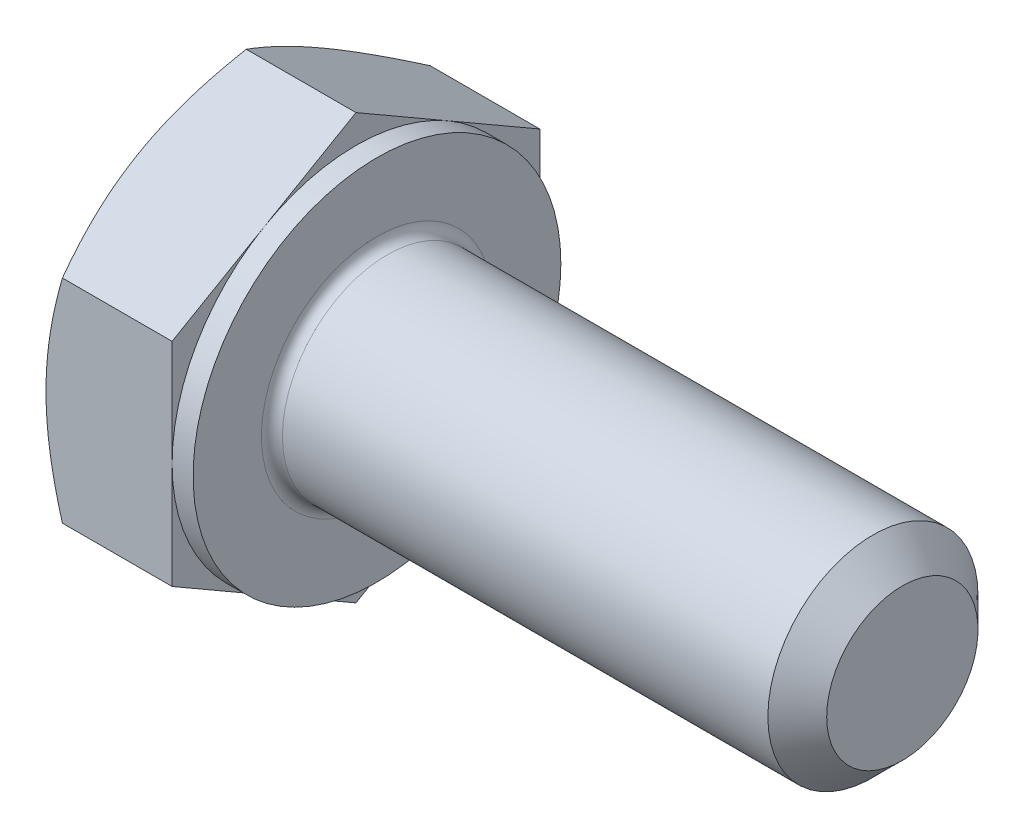
ISO-10303-21;
HEADER;
FILE_DESCRIPTION(('STEP AP214'),'2;1');
FILE_NAME('part.step','',(''),(''),'','','');
FILE_SCHEMA(('AUTOMOTIVE_DESIGN { 1 0 10303 214 1 1 1 1 }'));
ENDSEC;
DATA;
#1=APPLICATION_CONTEXT('core data for automotive mechanical design processes');
#2=APPLICATION_PROTOCOL_DEFINITION('international standard','automotive_design',2000,#1);
#3=PRODUCT_CONTEXT('',#1,'mechanical');
#4=PRODUCT('Part','Part','',(#3));
#5=PRODUCT_RELATED_PRODUCT_CATEGORY('part','',(#4));
#6=PRODUCT_DEFINITION_FORMATION('','',#4);
#7=PRODUCT_DEFINITION_CONTEXT('part definition',#1,'design');
#8=PRODUCT_DEFINITION('design','',#6,#7);
#9=PRODUCT_DEFINITION_SHAPE('','',#8);
#10=(LENGTH_UNIT() NAMED_UNIT(*) SI_UNIT(.MILLI.,.METRE.));
#11=(NAMED_UNIT(*) PLANE_ANGLE_UNIT() SI_UNIT($,.RADIAN.));
#12=(NAMED_UNIT(*) SI_UNIT($,.STERADIAN.) SOLID_ANGLE_UNIT());
#13=UNCERTAINTY_MEASURE_WITH_UNIT(LENGTH_MEASURE(1.E-05),#10,'distance_accuracy_value','');
#14=(GEOMETRIC_REPRESENTATION_CONTEXT(3) GLOBAL_UNCERTAINTY_ASSIGNED_CONTEXT((#13)) GLOBAL_UNIT_ASSIGNED_CONTEXT((#10,
#11,#12)) REPRESENTATION_CONTEXT('',''));
#15=CARTESIAN_POINT('',(0.,0.,0.));
#16=DIRECTION('',(0.,0.,1.));
#17=DIRECTION('',(1.,0.,0.));
#18=AXIS2_PLACEMENT_3D('',#15,#16,#17);
#19=CARTESIAN_POINT('',(2.8,2.02072594216368,-3.5));
#20=DIRECTION('',(0.,-0.866025403784438,0.500000000000002));
#21=DIRECTION('',(0.,-0.500000000000002,-0.866025403784438));
#22=AXIS2_PLACEMENT_3D('',#19,#20,#21);
#23=PLANE('',#22);
#24=DIRECTION('',(0.,0.500000000000002,0.866025403784438));
#25=VECTOR('',#24,1.);
#26=CARTESIAN_POINT('',(2.4,2.02072594216368,-3.5));
#27=LINE('',#26,#25);
#28=CARTESIAN_POINT('',(2.4,2.02072594216368,-3.5));
#29=VERTEX_POINT('',#28);
#30=CARTESIAN_POINT('',(2.4,3.03108891324553,-1.75000000000001));
#31=VERTEX_POINT('',#30);
#32=EDGE_CURVE('E176',#29,#31,#27,.T.);
#33=ORIENTED_EDGE('',*,*,#32,.F.);
#34=DIRECTION('',(-1.,0.,0.));
#35=VECTOR('',#34,1.);
#36=CARTESIAN_POINT('',(2.8,2.02072594216368,-3.5));
#37=LINE('',#36,#35);
#38=CARTESIAN_POINT('',(0.312607391169639,2.02072594216368,-3.5));
#39=VERTEX_POINT('',#38);
#40=EDGE_CURVE('E304',#29,#39,#37,.T.);
#41=ORIENTED_EDGE('',*,*,#40,.T.);
#42=CARTESIAN_POINT('',(0.312674060693371,4.04156735438122,0.00020000000000009));
#43=CARTESIAN_POINT('',(0.261385788989984,3.9527667384984,-0.153607178452449));
#44=CARTESIAN_POINT('',(0.214740953816198,3.86319960126198,-0.308742010834423));
#45=CARTESIAN_POINT('',(0.133321875533349,3.68251437287562,-0.621698006576781));
#46=CARTESIAN_POINT('',(0.0985764355845617,3.59139307116725,-0.779524730787495));
#47=CARTESIAN_POINT('',(0.0444900271828361,3.41027974688034,-1.09322221038013));
#48=CARTESIAN_POINT('',(0.0247890862603813,3.32031559103708,-1.24904469916069));
#49=CARTESIAN_POINT('',(0.00127013273725378,3.13996396008051,-1.56142288720537));
#50=CARTESIAN_POINT('',(-0.00256735545443556,3.04957714051106,-1.71797745103423));
#51=CARTESIAN_POINT('',(0.00541530187697638,2.88068384499777,-2.01050921992099));
#52=CARTESIAN_POINT('',(0.0152754340696055,2.80215208834114,-2.1465302124579));
#53=CARTESIAN_POINT('',(0.0465264668994014,2.64560020969753,-2.41768602028899));
#54=CARTESIAN_POINT('',(0.0679280432857958,2.56758062920649,-2.55281989768468));
#55=CARTESIAN_POINT('',(0.121430407880574,2.41070596159678,-2.82453479240518));
#56=CARTESIAN_POINT('',(0.153757994445084,2.33187072981463,-2.96108141927833));
#57=CARTESIAN_POINT('',(0.22712893380799,2.17537608630782,-3.2321380929445));
#58=CARTESIAN_POINT('',(0.268155046569863,2.09771466960098,-3.36665161246853));
#59=CARTESIAN_POINT('',(0.312674060693367,2.02061047210985,-3.5002));
#60=B_SPLINE_CURVE_WITH_KNOTS('',3,(#42,#43,#44,#45,#46,#47,#48,#49,#50,#51,#52,#53,#54,#55,#56,
#57,#58,#59),.UNSPECIFIED.,.F.,.F.,(4,2,2,2,2,2,2,2,4),(0.,0.554793832886253,1.11092123814984,
1.65328467083219,2.19498204478403,2.6666513085086,3.13875761298267,3.6213361260051,
4.10296698719187),.UNSPECIFIED.);
#61=CARTESIAN_POINT('',(0.,3.03108891324553,-1.75000000000001));
#62=VERTEX_POINT('',#61);
#63=EDGE_CURVE('E231',#62,#39,#60,.T.);
#64=ORIENTED_EDGE('',*,*,#63,.F.);
#65=CARTESIAN_POINT('',(0.312607391169643,4.04145188432738,0.));
#66=VERTEX_POINT('',#65);
#67=EDGE_CURVE('E67',#66,#62,#60,.T.);
#68=ORIENTED_EDGE('',*,*,#67,.F.);
#69=DIRECTION('',(-1.,0.,0.));
#70=VECTOR('',#69,1.);
#71=CARTESIAN_POINT('',(2.8,4.04145188432738,0.));
#72=LINE('',#71,#70);
#73=CARTESIAN_POINT('',(2.4,4.04145188432738,0.));
#74=VERTEX_POINT('',#73);
#75=EDGE_CURVE('E296',#74,#66,#72,.T.);
#76=ORIENTED_EDGE('',*,*,#75,.F.);
#77=EDGE_CURVE('E174',#31,#74,#27,.T.);
#78=ORIENTED_EDGE('',*,*,#77,.F.);
#79=EDGE_LOOP('',(#33,#41,#64,#68,#76,#78));
#80=FACE_BOUND('',#79,.T.);
#81=ADVANCED_FACE('F44',(#80),#23,.F.);
#82=CARTESIAN_POINT('',(2.8,4.04145188432738,0.));
#83=DIRECTION('',(0.,-0.866025403784438,-0.500000000000001));
#84=DIRECTION('',(0.,0.500000000000001,-0.866025403784438));
#85=AXIS2_PLACEMENT_3D('',#82,#83,#84);
#86=PLANE('',#85);
#87=DIRECTION('',(0.,-0.500000000000001,0.866025403784438));
#88=VECTOR('',#87,1.);
#89=CARTESIAN_POINT('',(2.4,4.04145188432738,0.));
#90=LINE('',#89,#88);
#91=CARTESIAN_POINT('',(2.4,3.03108891324553,1.75));
#92=VERTEX_POINT('',#91);
#93=EDGE_CURVE('E173',#74,#92,#90,.T.);
#94=ORIENTED_EDGE('',*,*,#93,.F.);
#95=ORIENTED_EDGE('',*,*,#75,.T.);
#96=CARTESIAN_POINT('',(0.31267406069337,2.02061047210985,3.5002));
#97=CARTESIAN_POINT('',(0.261385788989983,2.10941108799267,3.34639282154755));
#98=CARTESIAN_POINT('',(0.214740953816196,2.19897822522909,3.19125798916558));
#99=CARTESIAN_POINT('',(0.133321875533349,2.37966345361545,2.87830199342322));
#100=CARTESIAN_POINT('',(0.0985764355845616,2.47078475532382,2.72047526921251));
#101=CARTESIAN_POINT('',(0.0444900271828365,2.65189807961073,2.40677778961988));
#102=CARTESIAN_POINT('',(0.0247890862603821,2.74186223545399,2.25095530083931));
#103=CARTESIAN_POINT('',(0.00127013273725481,2.92221386641055,1.93857711279463));
#104=CARTESIAN_POINT('',(-0.00256735545443446,3.01260068598001,1.78202254896577));
#105=CARTESIAN_POINT('',(0.00541530187697789,3.1814939814933,1.48949078007901));
#106=CARTESIAN_POINT('',(0.0152754340696074,3.26002573814993,1.3534697875421));
#107=CARTESIAN_POINT('',(0.0465264668994039,3.41657761679354,1.08231397971101));
#108=CARTESIAN_POINT('',(0.0679280432857986,3.49459719728458,0.94718010231532));
#109=CARTESIAN_POINT('',(0.121430407880577,3.65147186489429,0.675465207594818));
#110=CARTESIAN_POINT('',(0.153757994445087,3.73030709667644,0.538918580721666));
#111=CARTESIAN_POINT('',(0.227128933807995,3.88680174018324,0.267861907055499));
#112=CARTESIAN_POINT('',(0.268155046569867,3.96446315689009,0.133348387531464));
#113=CARTESIAN_POINT('',(0.312674060693371,4.04156735438122,-0.000200000000000033));
#114=B_SPLINE_CURVE_WITH_KNOTS('',3,(#96,#97,#98,#99,#100,#101,#102,#103,#104,#105,#106,#107,
#108,#109,#110,#111,#112,#113),.UNSPECIFIED.,.F.,.F.,(4,2,2,2,2,2,2,2,4),(0.,0.554793832886253,
1.11092123814984,1.65328467083219,2.19498204478403,2.6666513085086,3.13875761298267,
3.6213361260051,4.10296698719188),.UNSPECIFIED.);
#115=CARTESIAN_POINT('',(0.,3.03108891324553,1.75));
#116=VERTEX_POINT('',#115);
#117=EDGE_CURVE('E228',#116,#66,#114,.T.);
#118=ORIENTED_EDGE('',*,*,#117,.F.);
#119=CARTESIAN_POINT('',(0.312607391169642,2.02072594216369,3.5));
#120=VERTEX_POINT('',#119);
#121=EDGE_CURVE('E242',#120,#116,#114,.T.);
#122=ORIENTED_EDGE('',*,*,#121,.F.);
#123=DIRECTION('',(-1.,0.,0.));
#124=VECTOR('',#123,1.);
#125=CARTESIAN_POINT('',(2.8,2.02072594216369,3.5));
#126=LINE('',#125,#124);
#127=CARTESIAN_POINT('',(2.4,2.02072594216369,3.5));
#128=VERTEX_POINT('',#127);
#129=EDGE_CURVE('E298',#128,#120,#126,.T.);
#130=ORIENTED_EDGE('',*,*,#129,.F.);
#131=EDGE_CURVE('E141',#92,#128,#90,.T.);
#132=ORIENTED_EDGE('',*,*,#131,.F.);
#133=EDGE_LOOP('',(#94,#95,#118,#122,#130,#132));
#134=FACE_BOUND('',#133,.T.);
#135=ADVANCED_FACE('F249',(#134),#86,.F.);
#136=CARTESIAN_POINT('',(2.8,2.02072594216369,3.5));
#137=DIRECTION('',(0.,0.,-1.));
#138=DIRECTION('',(0.,1.,0.));
#139=AXIS2_PLACEMENT_3D('',#136,#137,#138);
#140=PLANE('',#139);
#141=DIRECTION('',(0.,-1.,0.));
#142=VECTOR('',#141,1.);
#143=CARTESIAN_POINT('',(2.4,2.02072594216369,3.5));
#144=LINE('',#143,#142);
#145=CARTESIAN_POINT('',(2.4,0.,3.5));
#146=VERTEX_POINT('',#145);
#147=EDGE_CURVE('E135',#128,#146,#144,.T.);
#148=ORIENTED_EDGE('',*,*,#147,.F.);
#149=ORIENTED_EDGE('',*,*,#129,.T.);
#150=CARTESIAN_POINT('',(1.74876972157985,-5.5115599132137,3.5));
#151=CARTESIAN_POINT('',(1.67392335905172,-5.35795146168121,3.5));
#152=CARTESIAN_POINT('',(1.59977092482586,-5.20399921009229,3.5));
#153=CARTESIAN_POINT('',(1.45324265085097,-4.89522454872942,3.5));
#154=CARTESIAN_POINT('',(1.38086707569564,-4.74040201352889,3.5));
#155=CARTESIAN_POINT('',(1.23793493282187,-4.42894615034129,3.5));
#156=CARTESIAN_POINT('',(1.16738971082228,-4.27230759822603,3.5));
#157=CARTESIAN_POINT('',(1.02907715104182,-3.95781335182267,3.5));
#158=CARTESIAN_POINT('',(0.961309687300881,-3.79995771311103,3.5));
#159=CARTESIAN_POINT('',(0.827049257300872,-3.47741113153966,3.5));
#160=CARTESIAN_POINT('',(0.760677039603644,-3.31266966015408,3.5));
#161=CARTESIAN_POINT('',(0.632756390660457,-2.98129055183975,3.5));
#162=CARTESIAN_POINT('',(0.571208488744788,-2.81465270912936,3.5));
#163=CARTESIAN_POINT('',(0.45449093522313,-2.4795013503069,3.5));
#164=CARTESIAN_POINT('',(0.399309072211485,-2.31099212862997,3.5));
#165=CARTESIAN_POINT('',(0.297038623006441,-1.9715578800388,3.5));
#166=CARTESIAN_POINT('',(0.24994757531026,-1.80063360505408,3.5));
#167=CARTESIAN_POINT('',(0.166312731854845,-1.45721769418155,3.5));
#168=CARTESIAN_POINT('',(0.129709932807457,-1.284740691287,3.5));
#169=CARTESIAN_POINT('',(0.0690664438522187,-0.937557025087322,3.5));
#170=CARTESIAN_POINT('',(0.0450243878605948,-0.762850606367506,3.5));
#171=CARTESIAN_POINT('',(0.0117307991317262,-0.414396256841887,3.5));
#172=CARTESIAN_POINT('',(0.00228260582207095,-0.240667592567818,3.5));
#173=CARTESIAN_POINT('',(-0.00154556659444812,0.106974360360028,3.5));
#174=CARTESIAN_POINT('',(0.0040746764578058,0.280887651698036,3.5));
#175=CARTESIAN_POINT('',(0.0258160054827262,0.573677729994452,3.5));
#176=CARTESIAN_POINT('',(0.0381294862842104,0.692856453275192,3.5));
#177=CARTESIAN_POINT('',(0.0691104272904708,0.930390570440083,3.5));
#178=CARTESIAN_POINT('',(0.087778680144814,1.04874585973468,3.5));
#179=CARTESIAN_POINT('',(0.152339395306958,1.40238821087656,3.5));
#180=CARTESIAN_POINT('',(0.206777964143629,1.636135180366,3.5));
#181=CARTESIAN_POINT('',(0.301818253018758,1.98584040729011,3.5));
#182=CARTESIAN_POINT('',(0.336200477312341,2.10359260573206,3.5));
#183=CARTESIAN_POINT('',(0.408694225276307,2.33795452904031,3.5));
#184=CARTESIAN_POINT('',(0.446805777714548,2.45456424508593,3.5));
#185=CARTESIAN_POINT('',(0.526133500138817,2.68667648503229,3.5));
#186=CARTESIAN_POINT('',(0.56734879681971,2.80217931014602,3.5));
#187=CARTESIAN_POINT('',(0.652383318084217,3.03221622177691,3.5));
#188=CARTESIAN_POINT('',(0.696202482848095,3.1467503304798,3.5));
#189=CARTESIAN_POINT('',(0.81758641923347,3.45518824474217,3.5));
#190=CARTESIAN_POINT('',(0.897216282952764,3.64827858337667,3.5));
#191=CARTESIAN_POINT('',(1.061161216531,4.03246733734998,3.5));
#192=CARTESIAN_POINT('',(1.1454768083918,4.22356552793097,3.5));
#193=CARTESIAN_POINT('',(1.31768022375102,4.60422080078617,3.5));
#194=CARTESIAN_POINT('',(1.4055692882719,4.79377731975279,3.5));
#195=CARTESIAN_POINT('',(1.5840729420447,5.17160542987795,3.5));
#196=CARTESIAN_POINT('',(1.67468761529442,5.35987698121652,3.5));
#197=CARTESIAN_POINT('',(1.85818750847656,5.73567568183912,3.5));
#198=CARTESIAN_POINT('',(1.95107608160113,5.92320119040396,3.5));
#199=CARTESIAN_POINT('',(2.13854805032034,6.29740401332883,3.5));
#200=CARTESIAN_POINT('',(2.23313146399146,6.48408131861562,3.50000000000001));
#201=CARTESIAN_POINT('',(2.51886264902323,7.04299370579128,3.50000000000001));
#202=CARTESIAN_POINT('',(2.71203324129307,7.41419418594084,3.50000000000001));
#203=CARTESIAN_POINT('',(3.08131090771228,8.11545297373332,3.50000000000001));
#204=CARTESIAN_POINT('',(3.25705679900322,8.44570240603793,3.50000000000001));
#205=CARTESIAN_POINT('',(3.61066708019842,9.10509095269336,3.50000000000001));
#206=CARTESIAN_POINT('',(3.7885316009934,9.43422999681452,3.50000000000001));
#207=CARTESIAN_POINT('',(4.14522643131463,10.0905480448887,3.50000000000001));
#208=CARTESIAN_POINT('',(4.32405147197679,10.4177299168719,3.50000000000001));
#209=CARTESIAN_POINT('',(4.68290305302712,11.0714005801046,3.50000000000001));
#210=CARTESIAN_POINT('',(4.86292949694074,11.397889424295,3.50000000000001));
#211=CARTESIAN_POINT('',(5.04339321716841,11.7241348717818,3.50000000000001));
#212=B_SPLINE_CURVE_WITH_KNOTS('',3,(#150,#151,#152,#153,#154,#155,#156,#157,#158,#159,#160,
#161,#162,#163,#164,#165,#166,#167,#168,#169,#170,#171,#172,#173,#174,#175,#176,#177,#178,#179,
#180,#181,#182,#183,#184,#185,#186,#187,#188,#189,#190,#191,#192,#193,#194,#195,#196,#197,#198,
#199,#200,#201,#202,#203,#204,#205,#206,#207,#208,#209,#210,#211),.UNSPECIFIED.,.F.,.F.,(4,2,2,
2,2,2,2,2,2,2,2,2,2,2,2,2,2,2,2,2,2,2,2,2,2,2,2,2,2,2,4),(0.,0.512624455055139,1.02532478807014,
1.54067716579031,2.05600614845994,2.58877526662743,3.12160275933497,3.6533905567045,
4.18501627844403,4.71358974605644,5.24210571499796,5.76343550148057,6.28477297414902,
6.64403977227187,7.00335139923844,7.72232402023061,8.09029789782061,8.45827461416729,
8.82614817645966,9.19401329070561,9.82051720102627,10.4470910459092,11.0738843824793,
11.7006970553932,12.3284975462801,12.9563047370264,14.2116350789245,15.333929259245,
16.4562931392235,17.5748776783279,18.6933734490332),.UNSPECIFIED.);
#213=CARTESIAN_POINT('',(0.,0.,3.5));
#214=VERTEX_POINT('',#213);
#215=EDGE_CURVE('E243',#214,#120,#212,.T.);
#216=ORIENTED_EDGE('',*,*,#215,.F.);
#217=CARTESIAN_POINT('',(0.312607391169646,-2.0207259421637,3.5));
#218=VERTEX_POINT('',#217);
#219=EDGE_CURVE('E305',#218,#214,#212,.T.);
#220=ORIENTED_EDGE('',*,*,#219,.F.);
#221=DIRECTION('',(-1.,0.,0.));
#222=VECTOR('',#221,1.);
#223=CARTESIAN_POINT('',(2.8,-2.0207259421637,3.5));
#224=LINE('',#223,#222);
#225=CARTESIAN_POINT('',(2.4,-2.0207259421637,3.5));
#226=VERTEX_POINT('',#225);
#227=EDGE_CURVE('E167',#226,#218,#224,.T.);
#228=ORIENTED_EDGE('',*,*,#227,.F.);
#229=EDGE_CURVE('E145',#146,#226,#144,.T.);
#230=ORIENTED_EDGE('',*,*,#229,.F.);
#231=EDGE_LOOP('',(#148,#149,#216,#220,#228,#230));
#232=FACE_BOUND('',#231,.T.);
#233=ADVANCED_FACE('F165',(#232),#140,.F.);
#234=CARTESIAN_POINT('',(2.8,-4.0414518843274,0.));
#235=DIRECTION('',(0.,0.866025403784438,-0.500000000000001));
#236=DIRECTION('',(0.,0.500000000000001,0.866025403784438));
#237=AXIS2_PLACEMENT_3D('',#234,#235,#236);
#238=PLANE('',#237);
#239=DIRECTION('',(0.,-0.500000000000001,-0.866025403784438));
#240=VECTOR('',#239,1.);
#241=CARTESIAN_POINT('',(2.4,-4.0414518843274,0.));
#242=LINE('',#241,#240);
#243=CARTESIAN_POINT('',(2.4,-3.03108891324553,1.75));
#244=VERTEX_POINT('',#243);
#245=EDGE_CURVE('E152',#226,#244,#242,.T.);
#246=ORIENTED_EDGE('',*,*,#245,.F.);
#247=ORIENTED_EDGE('',*,*,#227,.T.);
#248=CARTESIAN_POINT('',(0.312674060693382,-4.04156735438124,-0.000200000000000035));
#249=CARTESIAN_POINT('',(0.261385788989995,-3.95276673849842,0.15360717845245));
#250=CARTESIAN_POINT('',(0.214740953816208,-3.863199601262,0.308742010834425));
#251=CARTESIAN_POINT('',(0.133321875533359,-3.68251437287564,0.621698006576784));
#252=CARTESIAN_POINT('',(0.0985764355845718,-3.59139307116727,0.779524730787499));
#253=CARTESIAN_POINT('',(0.0444900271828461,-3.41027974688035,1.09322221038013));
#254=CARTESIAN_POINT('',(0.0247890862603914,-3.3203155910371,1.2490446991607));
#255=CARTESIAN_POINT('',(0.00127013273726376,-3.13996396008053,1.56142288720538));
#256=CARTESIAN_POINT('',(-0.00256735545442558,-3.04957714051107,1.71797745103424));
#257=CARTESIAN_POINT('',(0.00541530187698662,-2.88068384499779,2.010509219921));
#258=CARTESIAN_POINT('',(0.0152754340696159,-2.80215208834116,2.14653021245791));
#259=CARTESIAN_POINT('',(0.0465264668994114,-2.64560020969755,2.417686020289));
#260=CARTESIAN_POINT('',(0.0679280432858054,-2.56758062920651,2.55281989768469));
#261=CARTESIAN_POINT('',(0.121430407880583,-2.4107059615968,2.82453479240519));
#262=CARTESIAN_POINT('',(0.153757994445093,-2.33187072981465,2.96108141927834));
#263=CARTESIAN_POINT('',(0.227128933807999,-2.17537608630784,3.2321380929445));
#264=CARTESIAN_POINT('',(0.268155046569871,-2.097714669601,3.36665161246854));
#265=CARTESIAN_POINT('',(0.312674060693374,-2.02061047210987,3.5002));
#266=B_SPLINE_CURVE_WITH_KNOTS('',3,(#248,#249,#250,#251,#252,#253,#254,#255,#256,#257,#258,
#259,#260,#261,#262,#263,#264,#265),.UNSPECIFIED.,.F.,.F.,(4,2,2,2,2,2,2,2,4),(0.,
0.554793832886257,1.11092123814984,1.65328467083219,2.19498204478404,2.66665130850861,
3.13875761298268,3.6213361260051,4.10296698719188),.UNSPECIFIED.);
#267=CARTESIAN_POINT('',(0.,-3.03108891324553,1.75));
#268=VERTEX_POINT('',#267);
#269=EDGE_CURVE('E230',#268,#218,#266,.T.);
#270=ORIENTED_EDGE('',*,*,#269,.F.);
#271=CARTESIAN_POINT('',(0.312607391169655,-4.0414518843274,0.));
#272=VERTEX_POINT('',#271);
#273=EDGE_CURVE('E222',#272,#268,#266,.T.);
#274=ORIENTED_EDGE('',*,*,#273,.F.);
#275=DIRECTION('',(-1.,0.,0.));
#276=VECTOR('',#275,1.);
#277=CARTESIAN_POINT('',(2.8,-4.0414518843274,0.));
#278=LINE('',#277,#276);
#279=CARTESIAN_POINT('',(2.4,-4.0414518843274,0.));
#280=VERTEX_POINT('',#279);
#281=EDGE_CURVE('E301',#280,#272,#278,.T.);
#282=ORIENTED_EDGE('',*,*,#281,.F.);
#283=EDGE_CURVE('E168',#244,#280,#242,.T.);
#284=ORIENTED_EDGE('',*,*,#283,.F.);
#285=EDGE_LOOP('',(#246,#247,#270,#274,#282,#284));
#286=FACE_BOUND('',#285,.T.);
#287=ADVANCED_FACE('F213',(#286),#238,.F.);
#288=CARTESIAN_POINT('',(2.8,-2.0207259421637,-3.5));
#289=DIRECTION('',(0.,0.866025403784437,0.500000000000002));
#290=DIRECTION('',(0.,-0.500000000000002,0.866025403784437));
#291=AXIS2_PLACEMENT_3D('',#288,#289,#290);
#292=PLANE('',#291);
#293=DIRECTION('',(0.,0.500000000000002,-0.866025403784437));
#294=VECTOR('',#293,1.);
#295=CARTESIAN_POINT('',(2.4,-2.0207259421637,-3.5));
#296=LINE('',#295,#294);
#297=CARTESIAN_POINT('',(2.4,-3.03108891324553,-1.75000000000001));
#298=VERTEX_POINT('',#297);
#299=EDGE_CURVE('E351',#280,#298,#296,.T.);
#300=ORIENTED_EDGE('',*,*,#299,.F.);
#301=ORIENTED_EDGE('',*,*,#281,.T.);
#302=CARTESIAN_POINT('',(0.312674060693372,-2.02061047210986,-3.5002));
#303=CARTESIAN_POINT('',(0.261385788989985,-2.10941108799268,-3.34639282154755));
#304=CARTESIAN_POINT('',(0.2147409538162,-2.1989782252291,-3.19125798916558));
#305=CARTESIAN_POINT('',(0.133321875533353,-2.37966345361546,-2.87830199342322));
#306=CARTESIAN_POINT('',(0.0985764355845658,-2.47078475532383,-2.7204752692125));
#307=CARTESIAN_POINT('',(0.0444900271828416,-2.65189807961075,-2.40677778961987));
#308=CARTESIAN_POINT('',(0.0247890862603875,-2.74186223545401,-2.25095530083931));
#309=CARTESIAN_POINT('',(0.00127013273726148,-2.92221386641057,-1.93857711279463));
#310=CARTESIAN_POINT('',(-0.00256735545442701,-3.01260068598003,-1.78202254896577));
#311=CARTESIAN_POINT('',(0.00541530187698661,-3.18149398149332,-1.48949078007901));
#312=CARTESIAN_POINT('',(0.0152754340696166,-3.26002573814994,-1.35346978754209));
#313=CARTESIAN_POINT('',(0.0465264668994137,-3.41657761679355,-1.08231397971101));
#314=CARTESIAN_POINT('',(0.0679280432858085,-3.49459719728459,-0.947180102315317));
#315=CARTESIAN_POINT('',(0.121430407880588,-3.65147186489431,-0.675465207594816));
#316=CARTESIAN_POINT('',(0.153757994445098,-3.73030709667646,-0.538918580721664));
#317=CARTESIAN_POINT('',(0.227128933808006,-3.88680174018326,-0.267861907055498));
#318=CARTESIAN_POINT('',(0.268155046569878,-3.96446315689011,-0.133348387531463));
#319=CARTESIAN_POINT('',(0.312674060693383,-4.04156735438124,0.000200000000000531));
#320=B_SPLINE_CURVE_WITH_KNOTS('',3,(#302,#303,#304,#305,#306,#307,#308,#309,#310,#311,#312,
#313,#314,#315,#316,#317,#318,#319),.UNSPECIFIED.,.F.,.F.,(4,2,2,2,2,2,2,2,4),(0.,
0.554793832886254,1.11092123814984,1.65328467083219,2.19498204478403,2.6666513085086,
3.13875761298268,3.6213361260051,4.10296698719188),.UNSPECIFIED.);
#321=CARTESIAN_POINT('',(0.,-3.03108891324553,-1.75000000000001));
#322=VERTEX_POINT('',#321);
#323=EDGE_CURVE('E229',#322,#272,#320,.T.);
#324=ORIENTED_EDGE('',*,*,#323,.F.);
#325=CARTESIAN_POINT('',(0.312607391169537,-2.02072594216386,-3.5));
#326=VERTEX_POINT('',#325);
#327=EDGE_CURVE('E190',#326,#322,#320,.T.);
#328=ORIENTED_EDGE('',*,*,#327,.F.);
#329=DIRECTION('',(-1.,0.,0.));
#330=VECTOR('',#329,1.);
#331=CARTESIAN_POINT('',(2.8,-2.0207259421637,-3.5));
#332=LINE('',#331,#330);
#333=CARTESIAN_POINT('',(2.4,-2.0207259421637,-3.5));
#334=VERTEX_POINT('',#333);
#335=EDGE_CURVE('E303',#334,#326,#332,.T.);
#336=ORIENTED_EDGE('',*,*,#335,.F.);
#337=EDGE_CURVE('E163',#298,#334,#296,.T.);
#338=ORIENTED_EDGE('',*,*,#337,.F.);
#339=EDGE_LOOP('',(#300,#301,#324,#328,#336,#338));
#340=FACE_BOUND('',#339,.T.);
#341=ADVANCED_FACE('F206',(#340),#292,.F.);
#342=CARTESIAN_POINT('',(2.8,2.02072594216368,-3.5));
#343=DIRECTION('',(0.,0.,1.));
#344=DIRECTION('',(0.,-1.,0.));
#345=AXIS2_PLACEMENT_3D('',#342,#343,#344);
#346=PLANE('',#345);
#347=DIRECTION('',(0.,1.,0.));
#348=VECTOR('',#347,1.);
#349=CARTESIAN_POINT('',(2.4,2.02072594216368,-3.5));
#350=LINE('',#349,#348);
#351=CARTESIAN_POINT('',(2.4,0.,-3.5));
#352=VERTEX_POINT('',#351);
#353=EDGE_CURVE('E275',#334,#352,#350,.T.);
#354=ORIENTED_EDGE('',*,*,#353,.F.);
#355=ORIENTED_EDGE('',*,*,#335,.T.);
#356=CARTESIAN_POINT('',(1.74876972324084,-5.51155991662168,-3.5));
#357=CARTESIAN_POINT('',(1.6739233606435,-5.35795146497444,-3.5));
#358=CARTESIAN_POINT('',(1.59977092634847,-5.20399921327068,-3.5));
#359=CARTESIAN_POINT('',(1.45324265223558,-4.8952245516778,-3.5));
#360=CARTESIAN_POINT('',(1.38086707701142,-4.74040201636209,-3.5));
#361=CARTESIAN_POINT('',(1.23793493399994,-4.4289461529424,-3.5));
#362=CARTESIAN_POINT('',(1.1673897119315,-4.27230760071023,-3.5));
#363=CARTESIAN_POINT('',(1.02907715201447,-3.95781335407225,-3.5));
#364=CARTESIAN_POINT('',(0.961309688205803,-3.79995771524291,-3.5));
#365=CARTESIAN_POINT('',(0.827049258068268,-3.47741113342681,-3.5));
#366=CARTESIAN_POINT('',(0.760677040301396,-3.31266966191411,-3.5));
#367=CARTESIAN_POINT('',(0.632756391222603,-2.98129055334352,-3.5));
#368=CARTESIAN_POINT('',(0.571208489240973,-2.81465271050398,-3.5));
#369=CARTESIAN_POINT('',(0.454490935593633,-2.47950135142085,-3.5));
#370=CARTESIAN_POINT('',(0.39930907252225,-2.3109921296124,-3.5));
#371=CARTESIAN_POINT('',(0.29703862320737,-1.97155788075464,-3.5));
#372=CARTESIAN_POINT('',(0.249947575461085,-1.80063360563484,-3.5));
#373=CARTESIAN_POINT('',(0.166312731904447,-1.45721769442351,-3.5));
#374=CARTESIAN_POINT('',(0.129709932809731,-1.28474069132432,-3.5));
#375=CARTESIAN_POINT('',(0.0690664437905981,-0.937557024710322,-3.5));
#376=CARTESIAN_POINT('',(0.0450243877823832,-0.762850605780846,-3.5));
#377=CARTESIAN_POINT('',(0.0117307990577607,-0.414396255839329,-3.5));
#378=CARTESIAN_POINT('',(0.0022826057682421,-0.240667591359067,-3.5));
#379=CARTESIAN_POINT('',(-0.00154556657178836,0.106974361978111,-3.5));
#380=CARTESIAN_POINT('',(0.00407467653682615,0.280887653519259,-3.5));
#381=CARTESIAN_POINT('',(0.0258160056757227,0.573677732069619,-3.5));
#382=CARTESIAN_POINT('',(0.0381294865222853,0.69285645540347,-3.5));
#383=CARTESIAN_POINT('',(0.069110427621081,0.930390572672174,-3.5));
#384=CARTESIAN_POINT('',(0.0877786805228815,1.04874586201748,-3.5));
#385=CARTESIAN_POINT('',(0.15233939582837,1.40238821330864,-3.5));
#386=CARTESIAN_POINT('',(0.206777964761839,1.63613518289361,-3.5));
#387=CARTESIAN_POINT('',(0.301818253779733,1.98584040996059,-3.5));
#388=CARTESIAN_POINT('',(0.33620047812123,2.10359260845121,-3.5));
#389=CARTESIAN_POINT('',(0.408694226179526,2.33795453185624,-3.5));
#390=CARTESIAN_POINT('',(0.446805778664183,2.45456424794996,-3.5));
#391=CARTESIAN_POINT('',(0.526133501179589,2.68667648799217,-3.5));
#392=CARTESIAN_POINT('',(0.567348797905198,2.80217931315364,-3.5));
#393=CARTESIAN_POINT('',(0.65238331925755,3.03221622488001,-3.5));
#394=CARTESIAN_POINT('',(0.696202484064557,3.14675033363064,-3.5));
#395=CARTESIAN_POINT('',(0.817586420524246,3.45518824791984,-3.5));
#396=CARTESIAN_POINT('',(0.897216284270019,3.64827858653486,-3.5));
#397=CARTESIAN_POINT('',(1.06116121789352,4.03246734047173,-3.5));
#398=CARTESIAN_POINT('',(1.1454768097731,4.22356553103575,-3.5));
#399=CARTESIAN_POINT('',(1.31768022516432,4.60422080385886,-3.5));
#400=CARTESIAN_POINT('',(1.40556928969841,4.79377732281035,-3.5));
#401=CARTESIAN_POINT('',(1.58407294349369,5.17160543290684,-3.5));
#402=CARTESIAN_POINT('',(1.67468761675267,5.35987698423188,-3.5));
#403=CARTESIAN_POINT('',(1.85818750995007,5.73567568482783,-3.5));
#404=CARTESIAN_POINT('',(1.95107608308062,5.92320119337955,-3.5));
#405=CARTESIAN_POINT('',(2.13854805180964,6.29740401627918,-3.5));
#406=CARTESIAN_POINT('',(2.23313146548458,6.48408132155383,-3.5));
#407=CARTESIAN_POINT('',(2.51886265052555,7.04299370869451,-3.5));
#408=CARTESIAN_POINT('',(2.71203324279836,7.41419418882235,-3.5));
#409=CARTESIAN_POINT('',(3.08131090922903,8.11545297659331,-3.5));
#410=CARTESIAN_POINT('',(3.257056800529,8.44570240889786,-3.49999999999999));
#411=CARTESIAN_POINT('',(3.61066708174042,9.10509095555401,-3.49999999999999));
#412=CARTESIAN_POINT('',(3.78853160254258,9.43422999967596,-3.49999999999999));
#413=CARTESIAN_POINT('',(4.14522643287858,10.0905480477554,-3.49999999999999));
#414=CARTESIAN_POINT('',(4.32405147354835,10.4177299197431,-3.49999999999999));
#415=CARTESIAN_POINT('',(4.68290305461308,11.0714005829853,-3.49999999999999));
#416=CARTESIAN_POINT('',(4.86292949853349,11.3978894271807,-3.49999999999999));
#417=CARTESIAN_POINT('',(5.04339321876768,11.7241348746726,-3.49999999999999));
#418=B_SPLINE_CURVE_WITH_KNOTS('',3,(#356,#357,#358,#359,#360,#361,#362,#363,#364,#365,#366,
#367,#368,#369,#370,#371,#372,#373,#374,#375,#376,#377,#378,#379,#380,#381,#382,#383,#384,#385,
#386,#387,#388,#389,#390,#391,#392,#393,#394,#395,#396,#397,#398,#399,#400,#401,#402,#403,#404,
#405,#406,#407,#408,#409,#410,#411,#412,#413,#414,#415,#416,#417),.UNSPECIFIED.,.F.,.F.,(4,2,2,
2,2,2,2,2,2,2,2,2,2,2,2,2,2,2,2,2,2,2,2,2,2,2,2,2,2,2,4),(0.,0.512624455455558,1.02532478887103,
1.54067716699584,2.05600615007007,2.58877526866933,3.12160276180877,3.65339055960882,
4.18501628177853,4.71358975001967,5.24210571958899,5.76343550668359,6.28477297996433,
6.64403977825953,7.00335140539848,7.72232402673615,8.09029790450666,8.45827462103385,
8.82614818350625,9.19401329793224,9.82051720822946,10.4470910530887,11.0738843896344,
11.7006970625238,12.3284975533834,12.9563047441025,14.211635085947,15.3339292662801,
16.4562931462709,17.574877685398,18.6933734561263),.UNSPECIFIED.);
#419=CARTESIAN_POINT('',(0.,0.,-3.5));
#420=VERTEX_POINT('',#419);
#421=EDGE_CURVE('E180',#420,#326,#418,.F.);
#422=ORIENTED_EDGE('',*,*,#421,.F.);
#423=EDGE_CURVE('E189',#39,#420,#418,.F.);
#424=ORIENTED_EDGE('',*,*,#423,.F.);
#425=ORIENTED_EDGE('',*,*,#40,.F.);
#426=EDGE_CURVE('E279',#352,#29,#350,.T.);
#427=ORIENTED_EDGE('',*,*,#426,.F.);
#428=EDGE_LOOP('',(#354,#355,#422,#424,#425,#427));
#429=FACE_BOUND('',#428,.T.);
#430=ADVANCED_FACE('F201',(#429),#346,.F.);
#431=CARTESIAN_POINT('',(0.,0.,0.));
#432=DIRECTION('',(1.,0.,0.));
#433=DIRECTION('',(0.,0.,-1.));
#434=AXIS2_PLACEMENT_3D('',#431,#432,#433);
#435=CONICAL_SURFACE('',#434,3.5,1.0471975511966);
#436=ORIENTED_EDGE('',*,*,#327,.T.);
#437=CARTESIAN_POINT('',(0.,0.,0.));
#438=DIRECTION('',(1.,0.,0.));
#439=DIRECTION('',(0.,0.,-1.));
#440=AXIS2_PLACEMENT_3D('',#437,#438,#439);
#441=CIRCLE('',#440,3.5);
#442=EDGE_CURVE('E292',#322,#420,#441,.T.);
#443=ORIENTED_EDGE('',*,*,#442,.T.);
#444=ORIENTED_EDGE('',*,*,#421,.T.);
#445=EDGE_LOOP('',(#436,#443,#444));
#446=FACE_BOUND('',#445,.T.);
#447=ADVANCED_FACE('F205',(#446),#435,.T.);
#448=ORIENTED_EDGE('',*,*,#273,.T.);
#449=EDGE_CURVE('E295',#268,#322,#441,.T.);
#450=ORIENTED_EDGE('',*,*,#449,.T.);
#451=ORIENTED_EDGE('',*,*,#323,.T.);
#452=EDGE_LOOP('',(#448,#450,#451));
#453=FACE_BOUND('',#452,.T.);
#454=ADVANCED_FACE('F348',(#453),#435,.T.);
#455=ORIENTED_EDGE('',*,*,#219,.T.);
#456=EDGE_CURVE('E325',#214,#268,#441,.T.);
#457=ORIENTED_EDGE('',*,*,#456,.T.);
#458=ORIENTED_EDGE('',*,*,#269,.T.);
#459=EDGE_LOOP('',(#455,#457,#458));
#460=FACE_BOUND('',#459,.T.);
#461=ADVANCED_FACE('F197',(#460),#435,.T.);
#462=ORIENTED_EDGE('',*,*,#215,.T.);
#463=ORIENTED_EDGE('',*,*,#121,.T.);
#464=CARTESIAN_POINT('',(0.,0.,0.));
#465=DIRECTION('',(-1.,0.,0.));
#466=DIRECTION('',(0.,0.,1.));
#467=AXIS2_PLACEMENT_3D('',#464,#465,#466);
#468=CIRCLE('',#467,3.5);
#469=EDGE_CURVE('E177',#214,#116,#468,.T.);
#470=ORIENTED_EDGE('',*,*,#469,.F.);
#471=EDGE_LOOP('',(#462,#463,#470));
#472=FACE_BOUND('',#471,.T.);
#473=ADVANCED_FACE('F319',(#472),#435,.T.);
#474=ORIENTED_EDGE('',*,*,#117,.T.);
#475=ORIENTED_EDGE('',*,*,#67,.T.);
#476=EDGE_CURVE('E290',#62,#116,#441,.T.);
#477=ORIENTED_EDGE('',*,*,#476,.T.);
#478=EDGE_LOOP('',(#474,#475,#477));
#479=FACE_BOUND('',#478,.T.);
#480=ADVANCED_FACE('F323',(#479),#435,.T.);
#481=ORIENTED_EDGE('',*,*,#63,.T.);
#482=ORIENTED_EDGE('',*,*,#423,.T.);
#483=EDGE_CURVE('E289',#420,#62,#441,.T.);
#484=ORIENTED_EDGE('',*,*,#483,.T.);
#485=EDGE_LOOP('',(#481,#482,#484));
#486=FACE_BOUND('',#485,.T.);
#487=ADVANCED_FACE('F339',(#486),#435,.T.);
#488=CARTESIAN_POINT('',(0.,0.,-6.99999999999998));
#489=DIRECTION('',(1.,0.,0.));
#490=DIRECTION('',(0.,0.,-1.));
#491=AXIS2_PLACEMENT_3D('',#488,#489,#490);
#492=PLANE('',#491);
#493=ORIENTED_EDGE('',*,*,#483,.F.);
#494=ORIENTED_EDGE('',*,*,#442,.F.);
#495=ORIENTED_EDGE('',*,*,#449,.F.);
#496=ORIENTED_EDGE('',*,*,#456,.F.);
#497=ORIENTED_EDGE('',*,*,#469,.T.);
#498=ORIENTED_EDGE('',*,*,#476,.F.);
#499=EDGE_LOOP('',(#493,#494,#495,#496,#497,#498));
#500=FACE_BOUND('',#499,.T.);
#501=ADVANCED_FACE('F208',(#500),#492,.F.);
#502=CARTESIAN_POINT('',(2.4,3.5,0.));
#503=DIRECTION('',(1.,0.,0.));
#504=DIRECTION('',(0.,0.,-1.));
#505=AXIS2_PLACEMENT_3D('',#502,#503,#504);
#506=PLANE('',#505);
#507=ORIENTED_EDGE('',*,*,#32,.T.);
#508=CARTESIAN_POINT('',(2.4,0.,0.));
#509=DIRECTION('',(-1.,0.,0.));
#510=DIRECTION('',(0.,0.,1.));
#511=AXIS2_PLACEMENT_3D('',#508,#509,#510);
#512=CIRCLE('',#511,3.5);
#513=EDGE_CURVE('E59',#31,#352,#512,.T.);
#514=ORIENTED_EDGE('',*,*,#513,.T.);
#515=ORIENTED_EDGE('',*,*,#426,.T.);
#516=EDGE_LOOP('',(#507,#514,#515));
#517=FACE_BOUND('',#516,.T.);
#518=ADVANCED_FACE('F357',(#517),#506,.T.);
#519=ORIENTED_EDGE('',*,*,#77,.T.);
#520=ORIENTED_EDGE('',*,*,#93,.T.);
#521=EDGE_CURVE('E162',#92,#31,#512,.T.);
#522=ORIENTED_EDGE('',*,*,#521,.T.);
#523=EDGE_LOOP('',(#519,#520,#522));
#524=FACE_BOUND('',#523,.T.);
#525=ADVANCED_FACE('F359',(#524),#506,.T.);
#526=ORIENTED_EDGE('',*,*,#131,.T.);
#527=ORIENTED_EDGE('',*,*,#147,.T.);
#528=EDGE_CURVE('E139',#146,#92,#512,.T.);
#529=ORIENTED_EDGE('',*,*,#528,.T.);
#530=EDGE_LOOP('',(#526,#527,#529));
#531=FACE_BOUND('',#530,.T.);
#532=ADVANCED_FACE('F137',(#531),#506,.T.);
#533=ORIENTED_EDGE('',*,*,#229,.T.);
#534=ORIENTED_EDGE('',*,*,#245,.T.);
#535=EDGE_CURVE('E149',#244,#146,#512,.T.);
#536=ORIENTED_EDGE('',*,*,#535,.T.);
#537=EDGE_LOOP('',(#533,#534,#536));
#538=FACE_BOUND('',#537,.T.);
#539=ADVANCED_FACE('F150',(#538),#506,.T.);
#540=ORIENTED_EDGE('',*,*,#283,.T.);
#541=ORIENTED_EDGE('',*,*,#299,.T.);
#542=EDGE_CURVE('E156',#298,#244,#512,.T.);
#543=ORIENTED_EDGE('',*,*,#542,.T.);
#544=EDGE_LOOP('',(#540,#541,#543));
#545=FACE_BOUND('',#544,.T.);
#546=ADVANCED_FACE('F373',(#545),#506,.T.);
#547=ORIENTED_EDGE('',*,*,#337,.T.);
#548=ORIENTED_EDGE('',*,*,#353,.T.);
#549=EDGE_CURVE('E356',#352,#298,#512,.T.);
#550=ORIENTED_EDGE('',*,*,#549,.T.);
#551=EDGE_LOOP('',(#547,#548,#550));
#552=FACE_BOUND('',#551,.T.);
#553=ADVANCED_FACE('F354',(#552),#506,.T.);
#554=CARTESIAN_POINT('',(0.,0.,0.));
#555=DIRECTION('',(-1.,0.,0.));
#556=DIRECTION('',(0.,0.,1.));
#557=AXIS2_PLACEMENT_3D('',#554,#555,#556);
#558=CYLINDRICAL_SURFACE('',#557,3.5);
#559=ORIENTED_EDGE('',*,*,#513,.F.);
#560=ORIENTED_EDGE('',*,*,#521,.F.);
#561=ORIENTED_EDGE('',*,*,#528,.F.);
#562=ORIENTED_EDGE('',*,*,#535,.F.);
#563=ORIENTED_EDGE('',*,*,#542,.F.);
#564=ORIENTED_EDGE('',*,*,#549,.F.);
#565=EDGE_LOOP('',(#559,#560,#561,#562,#563,#564));
#566=FACE_BOUND('',#565,.T.);
#567=CARTESIAN_POINT('',(2.8,0.,0.));
#568=DIRECTION('',(1.,0.,0.));
#569=DIRECTION('',(0.,0.,-1.));
#570=AXIS2_PLACEMENT_3D('',#567,#568,#569);
#571=CIRCLE('',#570,3.5);
#572=CARTESIAN_POINT('',(2.8,0.,-3.5));
#573=VERTEX_POINT('',#572);
#574=EDGE_CURVE('E288',#573,#573,#571,.T.);
#575=ORIENTED_EDGE('',*,*,#574,.F.);
#576=EDGE_LOOP('',(#575));
#577=FACE_BOUND('',#576,.T.);
#578=ADVANCED_FACE('F159',(#566,#577),#558,.T.);
#579=CARTESIAN_POINT('',(12.8,0.,0.));
#580=DIRECTION('',(-1.,0.,0.));
#581=DIRECTION('',(0.,0.,1.));
#582=AXIS2_PLACEMENT_3D('',#579,#580,#581);
#583=PLANE('',#582);
#584=CARTESIAN_POINT('',(12.8,0.,0.));
#585=DIRECTION('',(-1.,0.,0.));
#586=DIRECTION('',(0.,0.,1.));
#587=AXIS2_PLACEMENT_3D('',#584,#585,#586);
#588=CIRCLE('',#587,1.44);
#589=CARTESIAN_POINT('',(12.8,0.,1.44));
#590=VERTEX_POINT('',#589);
#591=EDGE_CURVE('E270',#590,#590,#588,.F.);
#592=ORIENTED_EDGE('',*,*,#591,.T.);
#593=EDGE_LOOP('',(#592));
#594=FACE_BOUND('',#593,.T.);
#595=ADVANCED_FACE('F367',(#594),#583,.F.);
#596=CARTESIAN_POINT('',(0.,0.,0.));
#597=DIRECTION('',(-1.,0.,0.));
#598=DIRECTION('',(0.,0.,1.));
#599=AXIS2_PLACEMENT_3D('',#596,#597,#598);
#600=CYLINDRICAL_SURFACE('',#599,2.);
#601=CARTESIAN_POINT('',(3.,0.,0.));
#602=DIRECTION('',(1.,0.,0.));
#603=DIRECTION('',(0.,0.,-1.));
#604=AXIS2_PLACEMENT_3D('',#601,#602,#603);
#605=CIRCLE('',#604,2.);
#606=CARTESIAN_POINT('',(3.,0.,-2.));
#607=VERTEX_POINT('',#606);
#608=EDGE_CURVE('E12',#607,#607,#605,.T.);
#609=ORIENTED_EDGE('',*,*,#608,.T.);
#610=EDGE_LOOP('',(#609));
#611=FACE_BOUND('',#610,.T.);
#612=CARTESIAN_POINT('',(12.24,0.,0.));
#613=DIRECTION('',(-1.,0.,0.));
#614=DIRECTION('',(0.,0.,1.));
#615=AXIS2_PLACEMENT_3D('',#612,#613,#614);
#616=CIRCLE('',#615,2.);
#617=CARTESIAN_POINT('',(12.24,0.,2.));
#618=VERTEX_POINT('',#617);
#619=EDGE_CURVE('E273',#618,#618,#616,.T.);
#620=ORIENTED_EDGE('',*,*,#619,.T.);
#621=EDGE_LOOP('',(#620));
#622=FACE_BOUND('',#621,.T.);
#623=ADVANCED_FACE('F265',(#611,#622),#600,.T.);
#624=CARTESIAN_POINT('',(2.8,0.,-6.99999999999998));
#625=DIRECTION('',(1.,0.,0.));
#626=DIRECTION('',(0.,0.,-1.));
#627=AXIS2_PLACEMENT_3D('',#624,#625,#626);
#628=PLANE('',#627);
#629=CARTESIAN_POINT('',(2.8,0.,0.));
#630=DIRECTION('',(1.,0.,0.));
#631=DIRECTION('',(0.,0.,-1.));
#632=AXIS2_PLACEMENT_3D('',#629,#630,#631);
#633=CIRCLE('',#632,2.2);
#634=CARTESIAN_POINT('',(2.8,0.,-2.2));
#635=VERTEX_POINT('',#634);
#636=EDGE_CURVE('E52',#635,#635,#633,.F.);
#637=ORIENTED_EDGE('',*,*,#636,.T.);
#638=EDGE_LOOP('',(#637));
#639=FACE_BOUND('',#638,.T.);
#640=ORIENTED_EDGE('',*,*,#574,.T.);
#641=EDGE_LOOP('',(#640));
#642=FACE_BOUND('',#641,.T.);
#643=ADVANCED_FACE('F258',(#639,#642),#628,.T.);
#644=CARTESIAN_POINT('',(12.24,0.,0.));
#645=DIRECTION('',(-1.,0.,0.));
#646=DIRECTION('',(0.,0.,1.));
#647=AXIS2_PLACEMENT_3D('',#644,#645,#646);
#648=CONICAL_SURFACE('',#647,2.,0.785398163397449);
#649=ORIENTED_EDGE('',*,*,#591,.F.);
#650=EDGE_LOOP('',(#649));
#651=FACE_BOUND('',#650,.T.);
#652=ORIENTED_EDGE('',*,*,#619,.F.);
#653=EDGE_LOOP('',(#652));
#654=FACE_BOUND('',#653,.T.);
#655=ADVANCED_FACE('F256',(#651,#654),#648,.T.);
#656=CARTESIAN_POINT('',(3.,0.,0.));
#657=DIRECTION('',(1.,0.,0.));
#658=DIRECTION('',(0.,0.,-1.));
#659=AXIS2_PLACEMENT_3D('',#656,#657,#658);
#660=TOROIDAL_SURFACE('',#659,2.2,0.2);
#661=ORIENTED_EDGE('',*,*,#608,.F.);
#662=EDGE_LOOP('',(#661));
#663=FACE_BOUND('',#662,.T.);
#664=ORIENTED_EDGE('',*,*,#636,.F.);
#665=EDGE_LOOP('',(#664));
#666=FACE_BOUND('',#665,.T.);
#667=ADVANCED_FACE('F46',(#663,#666),#660,.F.);
#668=CLOSED_SHELL('',(#81,#135,#233,#287,#341,#430,#447,#454,#461,#473,#480,#487,#501,#518,#525,
#532,#539,#546,#553,#578,#595,#623,#643,#655,#667));
#669=MANIFOLD_SOLID_BREP('B2',#668);
#670=ADVANCED_BREP_SHAPE_REPRESENTATION('',(#18,#669),#14);
#671=SHAPE_DEFINITION_REPRESENTATION(#9,#670);
ENDSEC;
END-ISO-10303-21;
